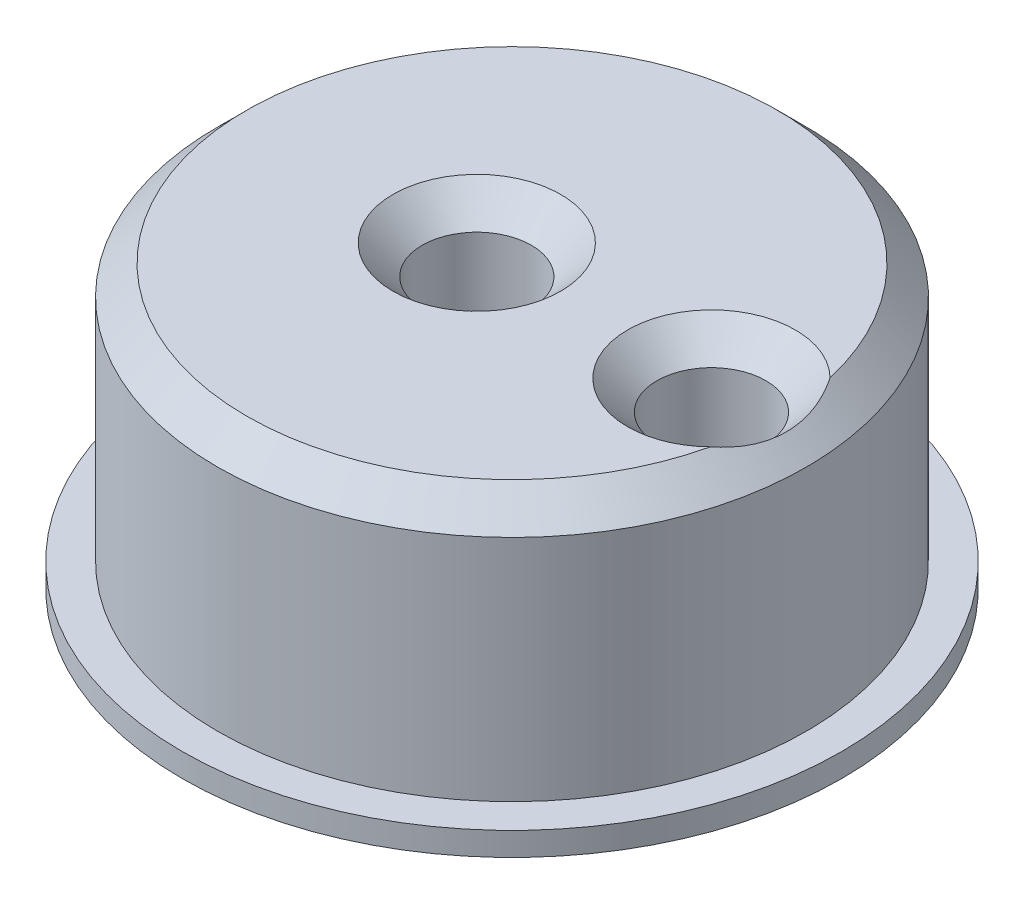
ISO-10303-21;
HEADER;
FILE_DESCRIPTION(('STEP AP214'),'2;1');
FILE_NAME('part.step','',(''),(''),'','','');
FILE_SCHEMA(('AUTOMOTIVE_DESIGN { 1 0 10303 214 1 1 1 1 }'));
ENDSEC;
DATA;
#1=APPLICATION_CONTEXT('core data for automotive mechanical design processes');
#2=APPLICATION_PROTOCOL_DEFINITION('international standard','automotive_design',2000,#1);
#3=PRODUCT_CONTEXT('',#1,'mechanical');
#4=PRODUCT('Part','Part','',(#3));
#5=PRODUCT_RELATED_PRODUCT_CATEGORY('part','',(#4));
#6=PRODUCT_DEFINITION_FORMATION('','',#4);
#7=PRODUCT_DEFINITION_CONTEXT('part definition',#1,'design');
#8=PRODUCT_DEFINITION('design','',#6,#7);
#9=PRODUCT_DEFINITION_SHAPE('','',#8);
#10=(LENGTH_UNIT() NAMED_UNIT(*) SI_UNIT(.MILLI.,.METRE.));
#11=(NAMED_UNIT(*) PLANE_ANGLE_UNIT() SI_UNIT($,.RADIAN.));
#12=(NAMED_UNIT(*) SI_UNIT($,.STERADIAN.) SOLID_ANGLE_UNIT());
#13=UNCERTAINTY_MEASURE_WITH_UNIT(LENGTH_MEASURE(1.E-05),#10,'distance_accuracy_value','');
#14=(GEOMETRIC_REPRESENTATION_CONTEXT(3) GLOBAL_UNCERTAINTY_ASSIGNED_CONTEXT((#13)) GLOBAL_UNIT_ASSIGNED_CONTEXT((#10,
#11,#12)) REPRESENTATION_CONTEXT('',''));
#15=CARTESIAN_POINT('',(0.,0.,0.));
#16=DIRECTION('',(0.,0.,1.));
#17=DIRECTION('',(1.,0.,0.));
#18=AXIS2_PLACEMENT_3D('',#15,#16,#17);
#19=CARTESIAN_POINT('',(0.,4.4,0.));
#20=DIRECTION('',(0.,1.,0.));
#21=DIRECTION('',(0.,0.,1.));
#22=AXIS2_PLACEMENT_3D('',#19,#20,#21);
#23=PLANE('',#22);
#24=CARTESIAN_POINT('',(-0.6,4.4,0.));
#25=DIRECTION('',(0.,1.,0.));
#26=DIRECTION('',(0.,0.,1.));
#27=AXIS2_PLACEMENT_3D('',#24,#25,#26);
#28=CIRCLE('',#27,1.43000000000001);
#29=CARTESIAN_POINT('',(-0.6,4.4,1.43000000000001));
#30=VERTEX_POINT('',#29);
#31=EDGE_CURVE('E52',#30,#30,#28,.F.);
#32=ORIENTED_EDGE('',*,*,#31,.T.);
#33=EDGE_LOOP('',(#32));
#34=FACE_BOUND('',#33,.T.);
#35=CARTESIAN_POINT('',(3.4,4.4,0.));
#36=DIRECTION('',(0.,1.,0.));
#37=DIRECTION('',(0.,0.,1.));
#38=AXIS2_PLACEMENT_3D('',#35,#36,#37);
#39=CIRCLE('',#38,1.43000000000001);
#40=CARTESIAN_POINT('',(3.4,4.4,1.43000000000001));
#41=VERTEX_POINT('',#40);
#42=CARTESIAN_POINT('',(4.40375,4.4,-1.01852144675506));
#43=VERTEX_POINT('',#42);
#44=EDGE_CURVE('E71',#41,#43,#39,.F.);
#45=ORIENTED_EDGE('',*,*,#44,.T.);
#46=CARTESIAN_POINT('',(0.,4.4,0.));
#47=DIRECTION('',(0.,1.,0.));
#48=DIRECTION('',(0.,0.,1.));
#49=AXIS2_PLACEMENT_3D('',#46,#47,#48);
#50=CIRCLE('',#49,4.52);
#51=CARTESIAN_POINT('',(0.,4.4,4.52));
#52=VERTEX_POINT('',#51);
#53=EDGE_CURVE('E84',#43,#52,#50,.T.);
#54=ORIENTED_EDGE('',*,*,#53,.T.);
#55=CARTESIAN_POINT('',(0.,4.4,0.));
#56=DIRECTION('',(0.,1.,0.));
#57=DIRECTION('',(0.,0.,1.));
#58=AXIS2_PLACEMENT_3D('',#55,#56,#57);
#59=CIRCLE('',#58,4.52);
#60=CARTESIAN_POINT('',(4.40375,4.4,1.01852144675506));
#61=VERTEX_POINT('',#60);
#62=EDGE_CURVE('E59',#52,#61,#59,.T.);
#63=ORIENTED_EDGE('',*,*,#62,.T.);
#64=CARTESIAN_POINT('',(3.4,4.4,0.));
#65=DIRECTION('',(0.,1.,0.));
#66=DIRECTION('',(0.,0.,1.));
#67=AXIS2_PLACEMENT_3D('',#64,#65,#66);
#68=CIRCLE('',#67,1.43000000000001);
#69=EDGE_CURVE('E69',#61,#41,#68,.F.);
#70=ORIENTED_EDGE('',*,*,#69,.T.);
#71=EDGE_LOOP('',(#45,#54,#63,#70));
#72=FACE_BOUND('',#71,.T.);
#73=ADVANCED_FACE('F37',(#34,#72),#23,.T.);
#74=CARTESIAN_POINT('',(0.,4.4,0.));
#75=DIRECTION('',(0.,-1.,0.));
#76=DIRECTION('',(0.,0.,-1.));
#77=AXIS2_PLACEMENT_3D('',#74,#75,#76);
#78=CYLINDRICAL_SURFACE('',#77,5.02);
#79=CARTESIAN_POINT('',(0.,3.9,0.));
#80=DIRECTION('',(0.,1.,0.));
#81=DIRECTION('',(0.,0.,1.));
#82=AXIS2_PLACEMENT_3D('',#79,#80,#81);
#83=CIRCLE('',#82,5.02);
#84=CARTESIAN_POINT('',(0.,3.9,5.02));
#85=VERTEX_POINT('',#84);
#86=EDGE_CURVE('E11',#85,#85,#83,.F.);
#87=ORIENTED_EDGE('',*,*,#86,.T.);
#88=EDGE_LOOP('',(#87));
#89=FACE_BOUND('',#88,.T.);
#90=CARTESIAN_POINT('',(0.,0.,0.));
#91=DIRECTION('',(0.,1.,0.));
#92=DIRECTION('',(0.,0.,1.));
#93=AXIS2_PLACEMENT_3D('',#90,#91,#92);
#94=CIRCLE('',#93,5.02);
#95=CARTESIAN_POINT('',(0.,0.,5.02));
#96=VERTEX_POINT('',#95);
#97=EDGE_CURVE('E111',#96,#96,#94,.T.);
#98=ORIENTED_EDGE('',*,*,#97,.T.);
#99=EDGE_LOOP('',(#98));
#100=FACE_BOUND('',#99,.T.);
#101=ADVANCED_FACE('F142',(#89,#100),#78,.T.);
#102=CARTESIAN_POINT('',(3.4,4.4,0.));
#103=DIRECTION('',(0.,-1.,0.));
#104=DIRECTION('',(0.,0.,-1.));
#105=AXIS2_PLACEMENT_3D('',#102,#103,#104);
#106=CYLINDRICAL_SURFACE('',#105,0.930000000000002);
#107=CARTESIAN_POINT('',(3.4,0.0999999999999994,0.));
#108=DIRECTION('',(0.,-1.,0.));
#109=DIRECTION('',(0.,0.,-1.));
#110=AXIS2_PLACEMENT_3D('',#107,#108,#109);
#111=CIRCLE('',#110,0.930000000000002);
#112=CARTESIAN_POINT('',(3.4,0.0999999999999994,-0.930000000000002));
#113=VERTEX_POINT('',#112);
#114=EDGE_CURVE('E105',#113,#113,#111,.T.);
#115=ORIENTED_EDGE('',*,*,#114,.T.);
#116=EDGE_LOOP('',(#115));
#117=FACE_BOUND('',#116,.T.);
#118=CARTESIAN_POINT('',(3.4,3.9,0.));
#119=DIRECTION('',(0.,1.,0.));
#120=DIRECTION('',(0.,0.,1.));
#121=AXIS2_PLACEMENT_3D('',#118,#119,#120);
#122=CIRCLE('',#121,0.930000000000002);
#123=CARTESIAN_POINT('',(3.4,3.9,0.930000000000002));
#124=VERTEX_POINT('',#123);
#125=EDGE_CURVE('E108',#124,#124,#122,.T.);
#126=ORIENTED_EDGE('',*,*,#125,.T.);
#127=EDGE_LOOP('',(#126));
#128=FACE_BOUND('',#127,.T.);
#129=ADVANCED_FACE('F147',(#117,#128),#106,.F.);
#130=CARTESIAN_POINT('',(-0.6,4.4,0.));
#131=DIRECTION('',(0.,-1.,0.));
#132=DIRECTION('',(0.,0.,-1.));
#133=AXIS2_PLACEMENT_3D('',#130,#131,#132);
#134=CYLINDRICAL_SURFACE('',#133,0.93);
#135=CARTESIAN_POINT('',(-0.6,0.100000000000002,0.));
#136=DIRECTION('',(0.,-1.,0.));
#137=DIRECTION('',(0.,0.,-1.));
#138=AXIS2_PLACEMENT_3D('',#135,#136,#137);
#139=CIRCLE('',#138,0.93);
#140=CARTESIAN_POINT('',(-0.6,0.100000000000002,-0.93));
#141=VERTEX_POINT('',#140);
#142=EDGE_CURVE('E76',#141,#141,#139,.T.);
#143=ORIENTED_EDGE('',*,*,#142,.T.);
#144=EDGE_LOOP('',(#143));
#145=FACE_BOUND('',#144,.T.);
#146=CARTESIAN_POINT('',(-0.6,3.9,0.));
#147=DIRECTION('',(0.,1.,0.));
#148=DIRECTION('',(0.,0.,1.));
#149=AXIS2_PLACEMENT_3D('',#146,#147,#148);
#150=CIRCLE('',#149,0.93);
#151=CARTESIAN_POINT('',(-0.6,3.9,0.930000000000001));
#152=VERTEX_POINT('',#151);
#153=EDGE_CURVE('E79',#152,#152,#150,.T.);
#154=ORIENTED_EDGE('',*,*,#153,.T.);
#155=EDGE_LOOP('',(#154));
#156=FACE_BOUND('',#155,.T.);
#157=ADVANCED_FACE('F137',(#145,#156),#134,.F.);
#158=CARTESIAN_POINT('',(0.,-0.4,0.));
#159=DIRECTION('',(0.,-1.,0.));
#160=DIRECTION('',(0.,0.,-1.));
#161=AXIS2_PLACEMENT_3D('',#158,#159,#160);
#162=PLANE('',#161);
#163=CARTESIAN_POINT('',(3.4,-0.4,0.));
#164=DIRECTION('',(0.,-1.,0.));
#165=DIRECTION('',(0.,0.,-1.));
#166=AXIS2_PLACEMENT_3D('',#163,#164,#165);
#167=CIRCLE('',#166,1.43);
#168=CARTESIAN_POINT('',(3.4,-0.4,-1.43));
#169=VERTEX_POINT('',#168);
#170=EDGE_CURVE('E98',#169,#169,#167,.F.);
#171=ORIENTED_EDGE('',*,*,#170,.T.);
#172=EDGE_LOOP('',(#171));
#173=FACE_BOUND('',#172,.T.);
#174=CARTESIAN_POINT('',(-0.6,-0.4,0.));
#175=DIRECTION('',(0.,-1.,0.));
#176=DIRECTION('',(0.,0.,-1.));
#177=AXIS2_PLACEMENT_3D('',#174,#175,#176);
#178=CIRCLE('',#177,1.43);
#179=CARTESIAN_POINT('',(-0.6,-0.4,-1.43));
#180=VERTEX_POINT('',#179);
#181=EDGE_CURVE('E100',#180,#180,#178,.F.);
#182=ORIENTED_EDGE('',*,*,#181,.T.);
#183=EDGE_LOOP('',(#182));
#184=FACE_BOUND('',#183,.T.);
#185=CARTESIAN_POINT('',(0.,-0.4,0.));
#186=DIRECTION('',(0.,-1.,0.));
#187=DIRECTION('',(0.,0.,-1.));
#188=AXIS2_PLACEMENT_3D('',#185,#186,#187);
#189=CIRCLE('',#188,5.62);
#190=CARTESIAN_POINT('',(0.,-0.4,-5.62));
#191=VERTEX_POINT('',#190);
#192=EDGE_CURVE('E114',#191,#191,#189,.T.);
#193=ORIENTED_EDGE('',*,*,#192,.T.);
#194=EDGE_LOOP('',(#193));
#195=FACE_BOUND('',#194,.T.);
#196=ADVANCED_FACE('F121',(#173,#184,#195),#162,.T.);
#197=CARTESIAN_POINT('',(0.,0.,0.));
#198=DIRECTION('',(0.,-1.,0.));
#199=DIRECTION('',(0.,0.,-1.));
#200=AXIS2_PLACEMENT_3D('',#197,#198,#199);
#201=PLANE('',#200);
#202=ORIENTED_EDGE('',*,*,#97,.F.);
#203=EDGE_LOOP('',(#202));
#204=FACE_BOUND('',#203,.T.);
#205=CARTESIAN_POINT('',(0.,0.,0.));
#206=DIRECTION('',(0.,-1.,0.));
#207=DIRECTION('',(0.,0.,-1.));
#208=AXIS2_PLACEMENT_3D('',#205,#206,#207);
#209=CIRCLE('',#208,5.62);
#210=CARTESIAN_POINT('',(0.,0.,-5.62));
#211=VERTEX_POINT('',#210);
#212=EDGE_CURVE('E115',#211,#211,#209,.T.);
#213=ORIENTED_EDGE('',*,*,#212,.F.);
#214=EDGE_LOOP('',(#213));
#215=FACE_BOUND('',#214,.T.);
#216=ADVANCED_FACE('F127',(#204,#215),#201,.F.);
#217=CARTESIAN_POINT('',(0.,-0.4,0.));
#218=DIRECTION('',(0.,1.,0.));
#219=DIRECTION('',(0.,0.,1.));
#220=AXIS2_PLACEMENT_3D('',#217,#218,#219);
#221=CYLINDRICAL_SURFACE('',#220,5.62);
#222=ORIENTED_EDGE('',*,*,#192,.F.);
#223=EDGE_LOOP('',(#222));
#224=FACE_BOUND('',#223,.T.);
#225=ORIENTED_EDGE('',*,*,#212,.T.);
#226=EDGE_LOOP('',(#225));
#227=FACE_BOUND('',#226,.T.);
#228=ADVANCED_FACE('F123',(#224,#227),#221,.T.);
#229=CARTESIAN_POINT('',(3.4,0.0999999999999994,0.));
#230=DIRECTION('',(0.,-1.,0.));
#231=DIRECTION('',(0.,0.,-1.));
#232=AXIS2_PLACEMENT_3D('',#229,#230,#231);
#233=CONICAL_SURFACE('',#232,0.930000000000002,0.785398163397449);
#234=ORIENTED_EDGE('',*,*,#170,.F.);
#235=EDGE_LOOP('',(#234));
#236=FACE_BOUND('',#235,.T.);
#237=ORIENTED_EDGE('',*,*,#114,.F.);
#238=EDGE_LOOP('',(#237));
#239=FACE_BOUND('',#238,.T.);
#240=ADVANCED_FACE('F126',(#236,#239),#233,.F.);
#241=CARTESIAN_POINT('',(-0.6,0.100000000000002,0.));
#242=DIRECTION('',(0.,-1.,0.));
#243=DIRECTION('',(0.,0.,-1.));
#244=AXIS2_PLACEMENT_3D('',#241,#242,#243);
#245=CONICAL_SURFACE('',#244,0.93,0.785398163397448);
#246=ORIENTED_EDGE('',*,*,#181,.F.);
#247=EDGE_LOOP('',(#246));
#248=FACE_BOUND('',#247,.T.);
#249=ORIENTED_EDGE('',*,*,#142,.F.);
#250=EDGE_LOOP('',(#249));
#251=FACE_BOUND('',#250,.T.);
#252=ADVANCED_FACE('F93',(#248,#251),#245,.F.);
#253=CARTESIAN_POINT('',(-0.6,3.9,0.));
#254=DIRECTION('',(0.,1.,0.));
#255=DIRECTION('',(0.,0.,1.));
#256=AXIS2_PLACEMENT_3D('',#253,#254,#255);
#257=CONICAL_SURFACE('',#256,0.93,0.78539816339745);
#258=ORIENTED_EDGE('',*,*,#31,.F.);
#259=EDGE_LOOP('',(#258));
#260=FACE_BOUND('',#259,.T.);
#261=ORIENTED_EDGE('',*,*,#153,.F.);
#262=EDGE_LOOP('',(#261));
#263=FACE_BOUND('',#262,.T.);
#264=ADVANCED_FACE('F90',(#260,#263),#257,.F.);
#265=CARTESIAN_POINT('',(3.4,3.9,0.));
#266=DIRECTION('',(0.,1.,0.));
#267=DIRECTION('',(0.,0.,1.));
#268=AXIS2_PLACEMENT_3D('',#265,#266,#267);
#269=CONICAL_SURFACE('',#268,0.930000000000002,0.78539816339745);
#270=ORIENTED_EDGE('',*,*,#125,.F.);
#271=EDGE_LOOP('',(#270));
#272=FACE_BOUND('',#271,.T.);
#273=CARTESIAN_POINT('',(4.4034,4.4002,-1.01914693739422));
#274=CARTESIAN_POINT('',(4.43043808743368,4.38474966439969,-0.970860391657466));
#275=CARTESIAN_POINT('',(4.4558315617325,4.37023910766391,-0.921324098521345));
#276=CARTESIAN_POINT('',(4.502982641332,4.34329563357541,-0.819944457520286));
#277=CARTESIAN_POINT('',(4.52473643096095,4.33086489660649,-0.768098759772877));
#278=CARTESIAN_POINT('',(4.56424920771797,4.30828616700553,-0.66227225212714));
#279=CARTESIAN_POINT('',(4.5819988472085,4.29814351588078,-0.608286785124241));
#280=CARTESIAN_POINT('',(4.61308757530637,4.28037852840483,-0.498672838455363));
#281=CARTESIAN_POINT('',(4.62642836681367,4.27275521896796,-0.443045002212958));
#282=CARTESIAN_POINT('',(4.64805459176522,4.26039737612996,-0.332440697059679));
#283=CARTESIAN_POINT('',(4.65649345506475,4.25557516852582,-0.277504134815416));
#284=CARTESIAN_POINT('',(4.66880600006137,4.24853942854631,-0.166957707046071));
#285=CARTESIAN_POINT('',(4.6726800106157,4.24632570825252,-0.111347890314648));
#286=CARTESIAN_POINT('',(4.67577044955501,4.24455974314385,-8.30876829082422E-05));
#287=CARTESIAN_POINT('',(4.67499770523527,4.2450013113032,0.0555714913249132));
#288=CARTESIAN_POINT('',(4.66884442363571,4.24851747219925,0.166521731911543));
#289=CARTESIAN_POINT('',(4.66346446603702,4.25159173368959,0.221817437762034));
#290=CARTESIAN_POINT('',(4.64230097400173,4.26368515771958,0.373990105257484));
#291=CARTESIAN_POINT('',(4.62169264478368,4.27546134584472,0.470020744485845));
#292=CARTESIAN_POINT('',(4.56761205205501,4.30636454167802,0.657129246949191));
#293=CARTESIAN_POINT('',(4.53413405827334,4.32549482382678,0.748204883298906));
#294=CARTESIAN_POINT('',(4.48121458797307,4.35573452116435,0.867387363948111));
#295=CARTESIAN_POINT('',(4.46654401127562,4.36411770785847,0.898412044381112));
#296=CARTESIAN_POINT('',(4.43591994581406,4.38161717384326,0.959488265013097));
#297=CARTESIAN_POINT('',(4.41997037543822,4.39073121405496,0.989542409517564));
#298=CARTESIAN_POINT('',(4.40340000000004,4.40019999999998,1.01914693739424));
#299=B_SPLINE_CURVE_WITH_KNOTS('',3,(#273,#274,#275,#276,#277,#278,#279,#280,#281,#282,#283,
#284,#285,#286,#287,#288,#289,#290,#291,#292,#293,#294,#295,#296,#297,#298),.UNSPECIFIED.,.F.,
.F.,(4,2,2,2,2,2,2,2,2,2,2,2,4),(0.,0.172363479896312,0.344906540339713,0.517848325384237,
0.690723234070512,0.857846390464823,1.02495750637873,1.1916793916894,1.35838030307767,
1.65374270218948,1.94923676523127,2.05518787832939,2.16082596164388),.UNSPECIFIED.);
#300=EDGE_CURVE('E42',#43,#61,#299,.T.);
#301=ORIENTED_EDGE('',*,*,#300,.F.);
#302=ORIENTED_EDGE('',*,*,#44,.F.);
#303=ORIENTED_EDGE('',*,*,#69,.F.);
#304=EDGE_LOOP('',(#301,#302,#303));
#305=FACE_BOUND('',#304,.T.);
#306=ADVANCED_FACE('F75',(#272,#305),#269,.F.);
#307=CARTESIAN_POINT('',(0.,4.4,0.));
#308=DIRECTION('',(0.,-1.,0.));
#309=DIRECTION('',(0.,0.,-1.));
#310=AXIS2_PLACEMENT_3D('',#307,#308,#309);
#311=CONICAL_SURFACE('',#310,4.52,0.785398163397448);
#312=ORIENTED_EDGE('',*,*,#86,.F.);
#313=EDGE_LOOP('',(#312));
#314=FACE_BOUND('',#313,.T.);
#315=ORIENTED_EDGE('',*,*,#53,.F.);
#316=ORIENTED_EDGE('',*,*,#300,.T.);
#317=ORIENTED_EDGE('',*,*,#62,.F.);
#318=EDGE_LOOP('',(#315,#316,#317));
#319=FACE_BOUND('',#318,.T.);
#320=ADVANCED_FACE('F40',(#314,#319),#311,.T.);
#321=CLOSED_SHELL('',(#73,#101,#129,#157,#196,#216,#228,#240,#252,#264,#306,#320));
#322=MANIFOLD_SOLID_BREP('B2',#321);
#323=ADVANCED_BREP_SHAPE_REPRESENTATION('',(#18,#322),#14);
#324=SHAPE_DEFINITION_REPRESENTATION(#9,#323);
ENDSEC;
END-ISO-10303-21;
